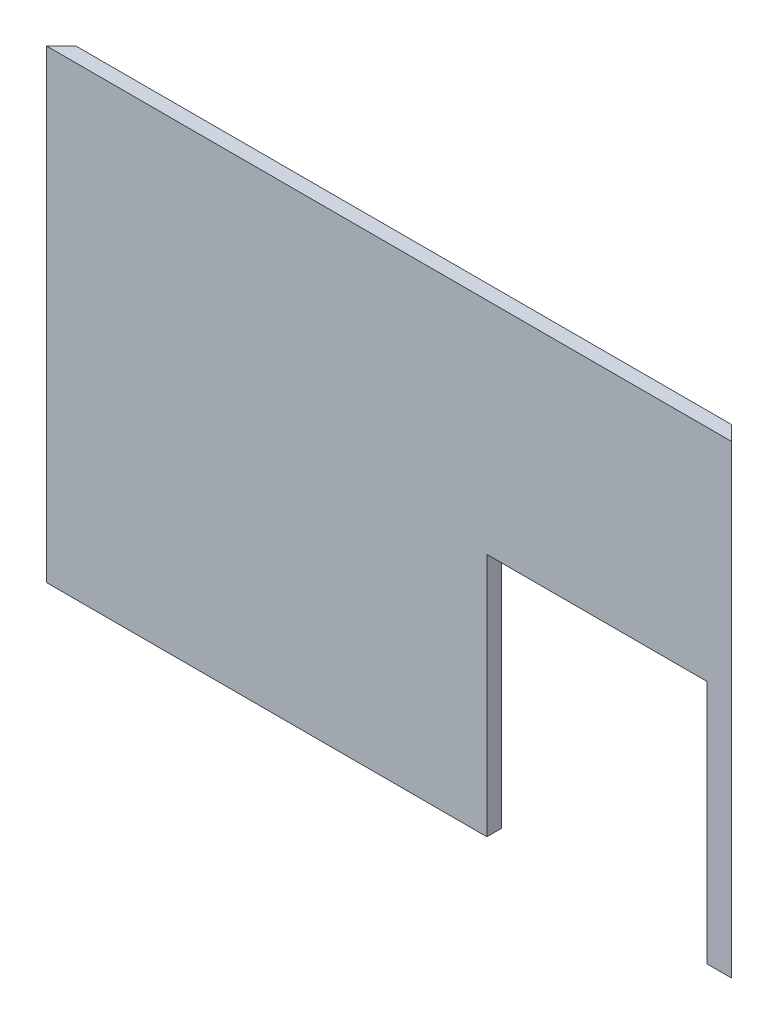
ISO-10303-21;
HEADER;
FILE_DESCRIPTION(('STEP AP214'),'2;1');
FILE_NAME('part.step','',(''),(''),'','','');
FILE_SCHEMA(('AUTOMOTIVE_DESIGN { 1 0 10303 214 1 1 1 1 }'));
ENDSEC;
DATA;
#1=APPLICATION_CONTEXT('core data for automotive mechanical design processes');
#2=APPLICATION_PROTOCOL_DEFINITION('international standard','automotive_design',2000,#1);
#3=PRODUCT_CONTEXT('',#1,'mechanical');
#4=PRODUCT('Part','Part','',(#3));
#5=PRODUCT_RELATED_PRODUCT_CATEGORY('part','',(#4));
#6=PRODUCT_DEFINITION_FORMATION('','',#4);
#7=PRODUCT_DEFINITION_CONTEXT('part definition',#1,'design');
#8=PRODUCT_DEFINITION('design','',#6,#7);
#9=PRODUCT_DEFINITION_SHAPE('','',#8);
#10=(LENGTH_UNIT() NAMED_UNIT(*) SI_UNIT(.MILLI.,.METRE.));
#11=(NAMED_UNIT(*) PLANE_ANGLE_UNIT() SI_UNIT($,.RADIAN.));
#12=(NAMED_UNIT(*) SI_UNIT($,.STERADIAN.) SOLID_ANGLE_UNIT());
#13=UNCERTAINTY_MEASURE_WITH_UNIT(LENGTH_MEASURE(1.E-05),#10,'distance_accuracy_value','');
#14=(GEOMETRIC_REPRESENTATION_CONTEXT(3) GLOBAL_UNCERTAINTY_ASSIGNED_CONTEXT((#13)) GLOBAL_UNIT_ASSIGNED_CONTEXT((#10,
#11,#12)) REPRESENTATION_CONTEXT('',''));
#15=CARTESIAN_POINT('',(0.,0.,0.));
#16=DIRECTION('',(0.,0.,1.));
#17=DIRECTION('',(1.,0.,0.));
#18=AXIS2_PLACEMENT_3D('',#15,#16,#17);
#19=CARTESIAN_POINT('',(0.,0.,0.));
#20=DIRECTION('',(0.,1.,0.));
#21=DIRECTION('',(0.,0.,1.));
#22=AXIS2_PLACEMENT_3D('',#19,#20,#21);
#23=PLANE('',#22);
#24=DIRECTION('',(-1.,0.,0.));
#25=VECTOR('',#24,1.);
#26=CARTESIAN_POINT('',(70.,0.,-1.50000000000001));
#27=LINE('',#26,#25);
#28=CARTESIAN_POINT('',(20.,0.,-1.50000000000001));
#29=VERTEX_POINT('',#28);
#30=CARTESIAN_POINT('',(-67.,0.,-1.49999999999999));
#31=VERTEX_POINT('',#30);
#32=EDGE_CURVE('E56',#29,#31,#27,.T.);
#33=ORIENTED_EDGE('',*,*,#32,.F.);
#34=DIRECTION('',(0.,0.,1.));
#35=VECTOR('',#34,1.);
#36=CARTESIAN_POINT('',(20.,0.,0.));
#37=LINE('',#36,#35);
#38=CARTESIAN_POINT('',(20.,0.,1.5));
#39=VERTEX_POINT('',#38);
#40=EDGE_CURVE('E41',#29,#39,#37,.T.);
#41=ORIENTED_EDGE('',*,*,#40,.T.);
#42=DIRECTION('',(1.,0.,0.));
#43=VECTOR('',#42,1.);
#44=CARTESIAN_POINT('',(70.,0.,1.49999999999999));
#45=LINE('',#44,#43);
#46=CARTESIAN_POINT('',(-70.,0.,1.50000000000001));
#47=VERTEX_POINT('',#46);
#48=EDGE_CURVE('E114',#47,#39,#45,.T.);
#49=ORIENTED_EDGE('',*,*,#48,.F.);
#50=DIRECTION('',(0.707106781186542,0.,-0.707106781186553));
#51=VECTOR('',#50,1.);
#52=CARTESIAN_POINT('',(-67.,0.,-1.50000000000001));
#53=LINE('',#52,#51);
#54=EDGE_CURVE('E159',#47,#31,#53,.T.);
#55=ORIENTED_EDGE('',*,*,#54,.T.);
#56=EDGE_LOOP('',(#33,#41,#49,#55));
#57=FACE_BOUND('',#56,.T.);
#58=ADVANCED_FACE('F33',(#57),#23,.F.);
#59=CARTESIAN_POINT('',(70.,95.,1.49999999999999));
#60=DIRECTION('',(0.,0.,-1.));
#61=DIRECTION('',(-1.,0.,0.));
#62=AXIS2_PLACEMENT_3D('',#59,#60,#61);
#63=PLANE('',#62);
#64=ORIENTED_EDGE('',*,*,#48,.T.);
#65=DIRECTION('',(0.,-1.,0.));
#66=VECTOR('',#65,1.);
#67=CARTESIAN_POINT('',(20.,50.,1.5));
#68=LINE('',#67,#66);
#69=CARTESIAN_POINT('',(20.,50.,1.5));
#70=VERTEX_POINT('',#69);
#71=EDGE_CURVE('E100',#70,#39,#68,.T.);
#72=ORIENTED_EDGE('',*,*,#71,.F.);
#73=DIRECTION('',(-1.,0.,0.));
#74=VECTOR('',#73,1.);
#75=CARTESIAN_POINT('',(20.,50.,1.5));
#76=LINE('',#75,#74);
#77=CARTESIAN_POINT('',(65.,50.,1.5));
#78=VERTEX_POINT('',#77);
#79=EDGE_CURVE('E169',#78,#70,#76,.T.);
#80=ORIENTED_EDGE('',*,*,#79,.F.);
#81=DIRECTION('',(0.,1.,0.));
#82=VECTOR('',#81,1.);
#83=CARTESIAN_POINT('',(65.,50.,1.5));
#84=LINE('',#83,#82);
#85=CARTESIAN_POINT('',(65.,0.,1.5));
#86=VERTEX_POINT('',#85);
#87=EDGE_CURVE('E109',#86,#78,#84,.T.);
#88=ORIENTED_EDGE('',*,*,#87,.F.);
#89=CARTESIAN_POINT('',(70.,0.,1.49999999999999));
#90=VERTEX_POINT('',#89);
#91=EDGE_CURVE('E119',#86,#90,#45,.T.);
#92=ORIENTED_EDGE('',*,*,#91,.T.);
#93=DIRECTION('',(0.,-1.,0.));
#94=VECTOR('',#93,1.);
#95=CARTESIAN_POINT('',(70.,95.,1.49999999999999));
#96=LINE('',#95,#94);
#97=CARTESIAN_POINT('',(70.,95.,1.49999999999999));
#98=VERTEX_POINT('',#97);
#99=EDGE_CURVE('E130',#98,#90,#96,.T.);
#100=ORIENTED_EDGE('',*,*,#99,.F.);
#101=DIRECTION('',(1.,0.,0.));
#102=VECTOR('',#101,1.);
#103=CARTESIAN_POINT('',(70.,95.,1.49999999999999));
#104=LINE('',#103,#102);
#105=CARTESIAN_POINT('',(-70.,95.,1.50000000000001));
#106=VERTEX_POINT('',#105);
#107=EDGE_CURVE('E129',#106,#98,#104,.T.);
#108=ORIENTED_EDGE('',*,*,#107,.F.);
#109=DIRECTION('',(0.,-1.,0.));
#110=VECTOR('',#109,1.);
#111=CARTESIAN_POINT('',(-70.,95.,1.50000000000001));
#112=LINE('',#111,#110);
#113=EDGE_CURVE('E118',#106,#47,#112,.T.);
#114=ORIENTED_EDGE('',*,*,#113,.T.);
#115=EDGE_LOOP('',(#64,#72,#80,#88,#92,#100,#108,#114));
#116=FACE_BOUND('',#115,.T.);
#117=ADVANCED_FACE('F35',(#116),#63,.F.);
#118=CARTESIAN_POINT('',(70.,95.,-1.50000000000001));
#119=DIRECTION('',(0.,0.,1.));
#120=DIRECTION('',(1.,0.,0.));
#121=AXIS2_PLACEMENT_3D('',#118,#119,#120);
#122=PLANE('',#121);
#123=DIRECTION('',(-1.,0.,0.));
#124=VECTOR('',#123,1.);
#125=CARTESIAN_POINT('',(70.,50.,-1.50000000000001));
#126=LINE('',#125,#124);
#127=CARTESIAN_POINT('',(65.,50.,-1.50000000000001));
#128=VERTEX_POINT('',#127);
#129=CARTESIAN_POINT('',(20.,50.,-1.50000000000001));
#130=VERTEX_POINT('',#129);
#131=EDGE_CURVE('E11',#128,#130,#126,.T.);
#132=ORIENTED_EDGE('',*,*,#131,.T.);
#133=DIRECTION('',(0.,-1.,0.));
#134=VECTOR('',#133,1.);
#135=CARTESIAN_POINT('',(20.,95.,-1.5));
#136=LINE('',#135,#134);
#137=EDGE_CURVE('E163',#130,#29,#136,.T.);
#138=ORIENTED_EDGE('',*,*,#137,.T.);
#139=ORIENTED_EDGE('',*,*,#32,.T.);
#140=DIRECTION('',(0.,1.,0.));
#141=VECTOR('',#140,1.);
#142=CARTESIAN_POINT('',(-67.,0.,-1.50000000000001));
#143=LINE('',#142,#141);
#144=CARTESIAN_POINT('',(-67.,95.,-1.50000000000001));
#145=VERTEX_POINT('',#144);
#146=EDGE_CURVE('E158',#31,#145,#143,.T.);
#147=ORIENTED_EDGE('',*,*,#146,.T.);
#148=DIRECTION('',(-1.,0.,0.));
#149=VECTOR('',#148,1.);
#150=CARTESIAN_POINT('',(70.,95.,-1.50000000000001));
#151=LINE('',#150,#149);
#152=CARTESIAN_POINT('',(67.,95.,-1.50000000000001));
#153=VERTEX_POINT('',#152);
#154=EDGE_CURVE('E125',#153,#145,#151,.T.);
#155=ORIENTED_EDGE('',*,*,#154,.F.);
#156=DIRECTION('',(0.,1.,0.));
#157=VECTOR('',#156,1.);
#158=CARTESIAN_POINT('',(67.,0.,-1.50000000000001));
#159=LINE('',#158,#157);
#160=CARTESIAN_POINT('',(67.,0.,-1.50000000000001));
#161=VERTEX_POINT('',#160);
#162=EDGE_CURVE('E123',#161,#153,#159,.T.);
#163=ORIENTED_EDGE('',*,*,#162,.F.);
#164=CARTESIAN_POINT('',(65.,0.,-1.50000000000001));
#165=VERTEX_POINT('',#164);
#166=EDGE_CURVE('E121',#161,#165,#27,.T.);
#167=ORIENTED_EDGE('',*,*,#166,.T.);
#168=DIRECTION('',(0.,1.,0.));
#169=VECTOR('',#168,1.);
#170=CARTESIAN_POINT('',(65.,95.,-1.50000000000001));
#171=LINE('',#170,#169);
#172=EDGE_CURVE('E48',#165,#128,#171,.T.);
#173=ORIENTED_EDGE('',*,*,#172,.T.);
#174=EDGE_LOOP('',(#132,#138,#139,#147,#155,#163,#167,#173));
#175=FACE_BOUND('',#174,.T.);
#176=ADVANCED_FACE('F142',(#175),#122,.F.);
#177=CARTESIAN_POINT('',(0.,95.,0.));
#178=DIRECTION('',(0.,1.,0.));
#179=DIRECTION('',(0.,0.,1.));
#180=AXIS2_PLACEMENT_3D('',#177,#178,#179);
#181=PLANE('',#180);
#182=DIRECTION('',(0.707106781186542,0.,-0.707106781186553));
#183=VECTOR('',#182,1.);
#184=CARTESIAN_POINT('',(-67.,95.,-1.50000000000001));
#185=LINE('',#184,#183);
#186=EDGE_CURVE('E157',#106,#145,#185,.T.);
#187=ORIENTED_EDGE('',*,*,#186,.F.);
#188=ORIENTED_EDGE('',*,*,#107,.T.);
#189=DIRECTION('',(0.707106781186543,0.,0.707106781186552));
#190=VECTOR('',#189,1.);
#191=CARTESIAN_POINT('',(67.,95.,-1.50000000000001));
#192=LINE('',#191,#190);
#193=EDGE_CURVE('E149',#153,#98,#192,.T.);
#194=ORIENTED_EDGE('',*,*,#193,.F.);
#195=ORIENTED_EDGE('',*,*,#154,.T.);
#196=EDGE_LOOP('',(#187,#188,#194,#195));
#197=FACE_BOUND('',#196,.T.);
#198=ADVANCED_FACE('F156',(#197),#181,.T.);
#199=ORIENTED_EDGE('',*,*,#91,.F.);
#200=DIRECTION('',(0.,0.,-1.));
#201=VECTOR('',#200,1.);
#202=CARTESIAN_POINT('',(65.,0.,0.));
#203=LINE('',#202,#201);
#204=EDGE_CURVE('E116',#86,#165,#203,.T.);
#205=ORIENTED_EDGE('',*,*,#204,.T.);
#206=ORIENTED_EDGE('',*,*,#166,.F.);
#207=DIRECTION('',(0.707106781186543,0.,0.707106781186552));
#208=VECTOR('',#207,1.);
#209=CARTESIAN_POINT('',(67.,0.,-1.50000000000001));
#210=LINE('',#209,#208);
#211=EDGE_CURVE('E147',#161,#90,#210,.T.);
#212=ORIENTED_EDGE('',*,*,#211,.T.);
#213=EDGE_LOOP('',(#199,#205,#206,#212));
#214=FACE_BOUND('',#213,.T.);
#215=ADVANCED_FACE('F137',(#214),#23,.F.);
#216=CARTESIAN_POINT('',(67.,0.,-1.50000000000001));
#217=DIRECTION('',(-0.707106781186552,0.,0.707106781186543));
#218=DIRECTION('',(0.707106781186543,0.,0.707106781186552));
#219=AXIS2_PLACEMENT_3D('',#216,#217,#218);
#220=PLANE('',#219);
#221=ORIENTED_EDGE('',*,*,#193,.T.);
#222=ORIENTED_EDGE('',*,*,#99,.T.);
#223=ORIENTED_EDGE('',*,*,#211,.F.);
#224=ORIENTED_EDGE('',*,*,#162,.T.);
#225=EDGE_LOOP('',(#221,#222,#223,#224));
#226=FACE_BOUND('',#225,.T.);
#227=ADVANCED_FACE('F183',(#226),#220,.F.);
#228=CARTESIAN_POINT('',(-67.,0.,-1.50000000000001));
#229=DIRECTION('',(0.707106781186553,0.,0.707106781186542));
#230=DIRECTION('',(0.707106781186542,0.,-0.707106781186553));
#231=AXIS2_PLACEMENT_3D('',#228,#229,#230);
#232=PLANE('',#231);
#233=ORIENTED_EDGE('',*,*,#186,.T.);
#234=ORIENTED_EDGE('',*,*,#146,.F.);
#235=ORIENTED_EDGE('',*,*,#54,.F.);
#236=ORIENTED_EDGE('',*,*,#113,.F.);
#237=EDGE_LOOP('',(#233,#234,#235,#236));
#238=FACE_BOUND('',#237,.T.);
#239=ADVANCED_FACE('F176',(#238),#232,.F.);
#240=CARTESIAN_POINT('',(20.,50.,-8.5));
#241=DIRECTION('',(0.,1.,0.));
#242=DIRECTION('',(-1.,0.,0.));
#243=AXIS2_PLACEMENT_3D('',#240,#241,#242);
#244=PLANE('',#243);
#245=DIRECTION('',(0.,0.,1.));
#246=VECTOR('',#245,1.);
#247=CARTESIAN_POINT('',(65.,50.,-8.5));
#248=LINE('',#247,#246);
#249=EDGE_CURVE('E167',#128,#78,#248,.T.);
#250=ORIENTED_EDGE('',*,*,#249,.T.);
#251=ORIENTED_EDGE('',*,*,#79,.T.);
#252=DIRECTION('',(0.,0.,1.));
#253=VECTOR('',#252,1.);
#254=CARTESIAN_POINT('',(20.,50.,-8.5));
#255=LINE('',#254,#253);
#256=EDGE_CURVE('E104',#130,#70,#255,.T.);
#257=ORIENTED_EDGE('',*,*,#256,.F.);
#258=ORIENTED_EDGE('',*,*,#131,.F.);
#259=EDGE_LOOP('',(#250,#251,#257,#258));
#260=FACE_BOUND('',#259,.T.);
#261=ADVANCED_FACE('F174',(#260),#244,.F.);
#262=CARTESIAN_POINT('',(20.,50.,-8.5));
#263=DIRECTION('',(-1.,0.,0.));
#264=DIRECTION('',(0.,-1.,0.));
#265=AXIS2_PLACEMENT_3D('',#262,#263,#264);
#266=PLANE('',#265);
#267=ORIENTED_EDGE('',*,*,#256,.T.);
#268=ORIENTED_EDGE('',*,*,#71,.T.);
#269=ORIENTED_EDGE('',*,*,#40,.F.);
#270=ORIENTED_EDGE('',*,*,#137,.F.);
#271=EDGE_LOOP('',(#267,#268,#269,#270));
#272=FACE_BOUND('',#271,.T.);
#273=ADVANCED_FACE('F102',(#272),#266,.F.);
#274=CARTESIAN_POINT('',(65.,50.,-8.5));
#275=DIRECTION('',(1.,0.,0.));
#276=DIRECTION('',(0.,1.,0.));
#277=AXIS2_PLACEMENT_3D('',#274,#275,#276);
#278=PLANE('',#277);
#279=ORIENTED_EDGE('',*,*,#204,.F.);
#280=ORIENTED_EDGE('',*,*,#87,.T.);
#281=ORIENTED_EDGE('',*,*,#249,.F.);
#282=ORIENTED_EDGE('',*,*,#172,.F.);
#283=EDGE_LOOP('',(#279,#280,#281,#282));
#284=FACE_BOUND('',#283,.T.);
#285=ADVANCED_FACE('F172',(#284),#278,.F.);
#286=CLOSED_SHELL('',(#58,#117,#176,#198,#215,#227,#239,#261,#273,#285));
#287=MANIFOLD_SOLID_BREP('B2',#286);
#288=ADVANCED_BREP_SHAPE_REPRESENTATION('',(#18,#287),#14);
#289=SHAPE_DEFINITION_REPRESENTATION(#9,#288);
ENDSEC;
END-ISO-10303-21;
